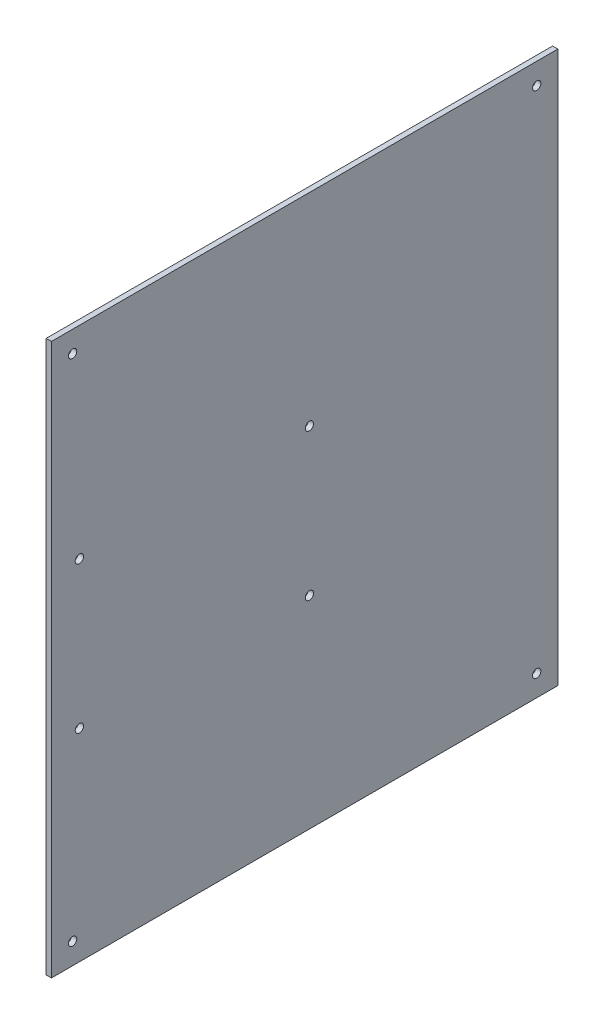
ISO-10303-21;
HEADER;
FILE_DESCRIPTION(('STEP AP214'),'2;1');
FILE_NAME('part.step','',(''),(''),'','','');
FILE_SCHEMA(('AUTOMOTIVE_DESIGN { 1 0 10303 214 1 1 1 1 }'));
ENDSEC;
DATA;
#1=APPLICATION_CONTEXT('core data for automotive mechanical design processes');
#2=APPLICATION_PROTOCOL_DEFINITION('international standard','automotive_design',2000,#1);
#3=PRODUCT_CONTEXT('',#1,'mechanical');
#4=PRODUCT('Part','Part','',(#3));
#5=PRODUCT_RELATED_PRODUCT_CATEGORY('part','',(#4));
#6=PRODUCT_DEFINITION_FORMATION('','',#4);
#7=PRODUCT_DEFINITION_CONTEXT('part definition',#1,'design');
#8=PRODUCT_DEFINITION('design','',#6,#7);
#9=PRODUCT_DEFINITION_SHAPE('','',#8);
#10=(LENGTH_UNIT() NAMED_UNIT(*) SI_UNIT(.MILLI.,.METRE.));
#11=(NAMED_UNIT(*) PLANE_ANGLE_UNIT() SI_UNIT($,.RADIAN.));
#12=(NAMED_UNIT(*) SI_UNIT($,.STERADIAN.) SOLID_ANGLE_UNIT());
#13=UNCERTAINTY_MEASURE_WITH_UNIT(LENGTH_MEASURE(1.E-05),#10,'distance_accuracy_value','');
#14=(GEOMETRIC_REPRESENTATION_CONTEXT(3) GLOBAL_UNCERTAINTY_ASSIGNED_CONTEXT((#13)) GLOBAL_UNIT_ASSIGNED_CONTEXT((#10,
#11,#12)) REPRESENTATION_CONTEXT('',''));
#15=CARTESIAN_POINT('',(0.,0.,0.));
#16=DIRECTION('',(0.,0.,1.));
#17=DIRECTION('',(1.,0.,0.));
#18=AXIS2_PLACEMENT_3D('',#15,#16,#17);
#19=CARTESIAN_POINT('',(1.58234,0.,-151.892));
#20=DIRECTION('',(0.,0.,1.));
#21=DIRECTION('',(1.,0.,0.));
#22=AXIS2_PLACEMENT_3D('',#19,#20,#21);
#23=PLANE('',#22);
#24=DIRECTION('',(0.,1.,0.));
#25=VECTOR('',#24,1.);
#26=CARTESIAN_POINT('',(0.,0.,-151.892));
#27=LINE('',#26,#25);
#28=CARTESIAN_POINT('',(0.,-82.677,-151.892));
#29=VERTEX_POINT('',#28);
#30=CARTESIAN_POINT('',(0.,82.677,-151.892));
#31=VERTEX_POINT('',#30);
#32=EDGE_CURVE('E126',#29,#31,#27,.T.);
#33=ORIENTED_EDGE('',*,*,#32,.T.);
#34=DIRECTION('',(-1.,0.,0.));
#35=VECTOR('',#34,1.);
#36=CARTESIAN_POINT('',(1.58234,82.677,-151.892));
#37=LINE('',#36,#35);
#38=CARTESIAN_POINT('',(1.58234,82.677,-151.892));
#39=VERTEX_POINT('',#38);
#40=EDGE_CURVE('E11',#39,#31,#37,.T.);
#41=ORIENTED_EDGE('',*,*,#40,.F.);
#42=DIRECTION('',(0.,1.,0.));
#43=VECTOR('',#42,1.);
#44=CARTESIAN_POINT('',(1.58234,0.,-151.892));
#45=LINE('',#44,#43);
#46=CARTESIAN_POINT('',(1.58234,-82.677,-151.892));
#47=VERTEX_POINT('',#46);
#48=EDGE_CURVE('E89',#47,#39,#45,.T.);
#49=ORIENTED_EDGE('',*,*,#48,.F.);
#50=DIRECTION('',(-1.,0.,0.));
#51=VECTOR('',#50,1.);
#52=CARTESIAN_POINT('',(1.58234,-82.677,-151.892));
#53=LINE('',#52,#51);
#54=EDGE_CURVE('E57',#47,#29,#53,.T.);
#55=ORIENTED_EDGE('',*,*,#54,.T.);
#56=EDGE_LOOP('',(#33,#41,#49,#55));
#57=FACE_BOUND('',#56,.T.);
#58=ADVANCED_FACE('F39',(#57),#23,.F.);
#59=CARTESIAN_POINT('',(1.58234,82.677,0.));
#60=DIRECTION('',(0.,-1.,0.));
#61=DIRECTION('',(0.,0.,-1.));
#62=AXIS2_PLACEMENT_3D('',#59,#60,#61);
#63=PLANE('',#62);
#64=DIRECTION('',(0.,0.,1.));
#65=VECTOR('',#64,1.);
#66=CARTESIAN_POINT('',(0.,82.677,0.));
#67=LINE('',#66,#65);
#68=CARTESIAN_POINT('',(0.,82.677,0.));
#69=VERTEX_POINT('',#68);
#70=EDGE_CURVE('E94',#31,#69,#67,.T.);
#71=ORIENTED_EDGE('',*,*,#70,.T.);
#72=DIRECTION('',(-1.,0.,0.));
#73=VECTOR('',#72,1.);
#74=CARTESIAN_POINT('',(1.58234,82.677,0.));
#75=LINE('',#74,#73);
#76=CARTESIAN_POINT('',(1.58234,82.677,0.));
#77=VERTEX_POINT('',#76);
#78=EDGE_CURVE('E48',#77,#69,#75,.T.);
#79=ORIENTED_EDGE('',*,*,#78,.F.);
#80=DIRECTION('',(0.,0.,1.));
#81=VECTOR('',#80,1.);
#82=CARTESIAN_POINT('',(1.58234,82.677,0.));
#83=LINE('',#82,#81);
#84=EDGE_CURVE('E83',#39,#77,#83,.T.);
#85=ORIENTED_EDGE('',*,*,#84,.F.);
#86=ORIENTED_EDGE('',*,*,#40,.T.);
#87=EDGE_LOOP('',(#71,#79,#85,#86));
#88=FACE_BOUND('',#87,.T.);
#89=ADVANCED_FACE('F92',(#88),#63,.F.);
#90=CARTESIAN_POINT('',(1.58234,0.,0.));
#91=DIRECTION('',(0.,0.,1.));
#92=DIRECTION('',(1.,0.,0.));
#93=AXIS2_PLACEMENT_3D('',#90,#91,#92);
#94=PLANE('',#93);
#95=DIRECTION('',(0.,1.,0.));
#96=VECTOR('',#95,1.);
#97=CARTESIAN_POINT('',(0.,0.,0.));
#98=LINE('',#97,#96);
#99=CARTESIAN_POINT('',(0.,-82.677,0.));
#100=VERTEX_POINT('',#99);
#101=EDGE_CURVE('E131',#100,#69,#98,.T.);
#102=ORIENTED_EDGE('',*,*,#101,.F.);
#103=DIRECTION('',(-1.,0.,0.));
#104=VECTOR('',#103,1.);
#105=CARTESIAN_POINT('',(1.58234,-82.677,0.));
#106=LINE('',#105,#104);
#107=CARTESIAN_POINT('',(1.58234,-82.677,0.));
#108=VERTEX_POINT('',#107);
#109=EDGE_CURVE('E68',#108,#100,#106,.T.);
#110=ORIENTED_EDGE('',*,*,#109,.F.);
#111=DIRECTION('',(0.,1.,0.));
#112=VECTOR('',#111,1.);
#113=CARTESIAN_POINT('',(1.58234,0.,0.));
#114=LINE('',#113,#112);
#115=EDGE_CURVE('E87',#108,#77,#114,.T.);
#116=ORIENTED_EDGE('',*,*,#115,.T.);
#117=ORIENTED_EDGE('',*,*,#78,.T.);
#118=EDGE_LOOP('',(#102,#110,#116,#117));
#119=FACE_BOUND('',#118,.T.);
#120=ADVANCED_FACE('F97',(#119),#94,.T.);
#121=CARTESIAN_POINT('',(1.58234,22.,-8.382));
#122=DIRECTION('',(-1.,0.,0.));
#123=DIRECTION('',(0.,0.,1.));
#124=AXIS2_PLACEMENT_3D('',#121,#122,#123);
#125=CYLINDRICAL_SURFACE('',#124,1.25);
#126=CARTESIAN_POINT('',(1.58234,22.,-8.382));
#127=DIRECTION('',(1.,0.,0.));
#128=DIRECTION('',(0.,0.,-1.));
#129=AXIS2_PLACEMENT_3D('',#126,#127,#128);
#130=CIRCLE('',#129,1.25);
#131=CARTESIAN_POINT('',(1.58234,22.,-9.632));
#132=VERTEX_POINT('',#131);
#133=EDGE_CURVE('E110',#132,#132,#130,.T.);
#134=ORIENTED_EDGE('',*,*,#133,.T.);
#135=EDGE_LOOP('',(#134));
#136=FACE_BOUND('',#135,.T.);
#137=CARTESIAN_POINT('',(0.,22.,-8.382));
#138=DIRECTION('',(1.,0.,0.));
#139=DIRECTION('',(0.,0.,-1.));
#140=AXIS2_PLACEMENT_3D('',#137,#138,#139);
#141=CIRCLE('',#140,1.25);
#142=CARTESIAN_POINT('',(0.,22.,-9.632));
#143=VERTEX_POINT('',#142);
#144=EDGE_CURVE('E145',#143,#143,#141,.T.);
#145=ORIENTED_EDGE('',*,*,#144,.F.);
#146=EDGE_LOOP('',(#145));
#147=FACE_BOUND('',#146,.T.);
#148=ADVANCED_FACE('F187',(#136,#147),#125,.F.);
#149=CARTESIAN_POINT('',(1.58234,76.327,-6.35));
#150=DIRECTION('',(-1.,0.,0.));
#151=DIRECTION('',(0.,0.,1.));
#152=AXIS2_PLACEMENT_3D('',#149,#150,#151);
#153=CYLINDRICAL_SURFACE('',#152,1.25);
#154=CARTESIAN_POINT('',(1.58234,76.327,-6.35));
#155=DIRECTION('',(1.,0.,0.));
#156=DIRECTION('',(0.,0.,-1.));
#157=AXIS2_PLACEMENT_3D('',#154,#155,#156);
#158=CIRCLE('',#157,1.25);
#159=CARTESIAN_POINT('',(1.58234,76.327,-7.6));
#160=VERTEX_POINT('',#159);
#161=EDGE_CURVE('E107',#160,#160,#158,.T.);
#162=ORIENTED_EDGE('',*,*,#161,.T.);
#163=EDGE_LOOP('',(#162));
#164=FACE_BOUND('',#163,.T.);
#165=CARTESIAN_POINT('',(0.,76.327,-6.35));
#166=DIRECTION('',(1.,0.,0.));
#167=DIRECTION('',(0.,0.,-1.));
#168=AXIS2_PLACEMENT_3D('',#165,#166,#167);
#169=CIRCLE('',#168,1.25);
#170=CARTESIAN_POINT('',(0.,76.327,-7.6));
#171=VERTEX_POINT('',#170);
#172=EDGE_CURVE('E137',#171,#171,#169,.T.);
#173=ORIENTED_EDGE('',*,*,#172,.F.);
#174=EDGE_LOOP('',(#173));
#175=FACE_BOUND('',#174,.T.);
#176=ADVANCED_FACE('F189',(#164,#175),#153,.F.);
#177=CARTESIAN_POINT('',(1.58234,76.327,-145.542));
#178=DIRECTION('',(-1.,0.,0.));
#179=DIRECTION('',(0.,0.,1.));
#180=AXIS2_PLACEMENT_3D('',#177,#178,#179);
#181=CYLINDRICAL_SURFACE('',#180,1.25);
#182=CARTESIAN_POINT('',(1.58234,76.327,-145.542));
#183=DIRECTION('',(1.,0.,0.));
#184=DIRECTION('',(0.,0.,-1.));
#185=AXIS2_PLACEMENT_3D('',#182,#183,#184);
#186=CIRCLE('',#185,1.25);
#187=CARTESIAN_POINT('',(1.58234,76.327,-146.792));
#188=VERTEX_POINT('',#187);
#189=EDGE_CURVE('E102',#188,#188,#186,.T.);
#190=ORIENTED_EDGE('',*,*,#189,.T.);
#191=EDGE_LOOP('',(#190));
#192=FACE_BOUND('',#191,.T.);
#193=CARTESIAN_POINT('',(0.,76.327,-145.542));
#194=DIRECTION('',(1.,0.,0.));
#195=DIRECTION('',(0.,0.,-1.));
#196=AXIS2_PLACEMENT_3D('',#193,#194,#195);
#197=CIRCLE('',#196,1.25);
#198=CARTESIAN_POINT('',(0.,76.327,-146.792));
#199=VERTEX_POINT('',#198);
#200=EDGE_CURVE('E136',#199,#199,#197,.T.);
#201=ORIENTED_EDGE('',*,*,#200,.F.);
#202=EDGE_LOOP('',(#201));
#203=FACE_BOUND('',#202,.T.);
#204=ADVANCED_FACE('F197',(#192,#203),#181,.F.);
#205=CARTESIAN_POINT('',(1.58234,-82.677,0.));
#206=DIRECTION('',(0.,-1.,0.));
#207=DIRECTION('',(0.,0.,-1.));
#208=AXIS2_PLACEMENT_3D('',#205,#206,#207);
#209=PLANE('',#208);
#210=DIRECTION('',(0.,0.,1.));
#211=VECTOR('',#210,1.);
#212=CARTESIAN_POINT('',(0.,-82.677,0.));
#213=LINE('',#212,#211);
#214=EDGE_CURVE('E133',#29,#100,#213,.T.);
#215=ORIENTED_EDGE('',*,*,#214,.F.);
#216=ORIENTED_EDGE('',*,*,#54,.F.);
#217=DIRECTION('',(0.,0.,1.));
#218=VECTOR('',#217,1.);
#219=CARTESIAN_POINT('',(1.58234,-82.677,0.));
#220=LINE('',#219,#218);
#221=EDGE_CURVE('E98',#47,#108,#220,.T.);
#222=ORIENTED_EDGE('',*,*,#221,.T.);
#223=ORIENTED_EDGE('',*,*,#109,.T.);
#224=EDGE_LOOP('',(#215,#216,#222,#223));
#225=FACE_BOUND('',#224,.T.);
#226=ADVANCED_FACE('F175',(#225),#209,.T.);
#227=CARTESIAN_POINT('',(1.58234,-76.327,-6.35));
#228=DIRECTION('',(-1.,0.,0.));
#229=DIRECTION('',(0.,0.,1.));
#230=AXIS2_PLACEMENT_3D('',#227,#228,#229);
#231=CYLINDRICAL_SURFACE('',#230,1.25);
#232=CARTESIAN_POINT('',(1.58234,-76.327,-6.35));
#233=DIRECTION('',(1.,0.,0.));
#234=DIRECTION('',(0.,0.,-1.));
#235=AXIS2_PLACEMENT_3D('',#232,#233,#234);
#236=CIRCLE('',#235,1.25);
#237=CARTESIAN_POINT('',(1.58234,-76.327,-7.6));
#238=VERTEX_POINT('',#237);
#239=EDGE_CURVE('E164',#238,#238,#236,.F.);
#240=ORIENTED_EDGE('',*,*,#239,.F.);
#241=EDGE_LOOP('',(#240));
#242=FACE_BOUND('',#241,.T.);
#243=CARTESIAN_POINT('',(0.,-76.327,-6.35));
#244=DIRECTION('',(1.,0.,0.));
#245=DIRECTION('',(0.,0.,-1.));
#246=AXIS2_PLACEMENT_3D('',#243,#244,#245);
#247=CIRCLE('',#246,1.25);
#248=CARTESIAN_POINT('',(0.,-76.327,-7.6));
#249=VERTEX_POINT('',#248);
#250=EDGE_CURVE('E124',#249,#249,#247,.F.);
#251=ORIENTED_EDGE('',*,*,#250,.T.);
#252=EDGE_LOOP('',(#251));
#253=FACE_BOUND('',#252,.T.);
#254=ADVANCED_FACE('F166',(#242,#253),#231,.F.);
#255=CARTESIAN_POINT('',(1.58234,-22.,-77.382));
#256=DIRECTION('',(-1.,0.,0.));
#257=DIRECTION('',(0.,0.,1.));
#258=AXIS2_PLACEMENT_3D('',#255,#256,#257);
#259=CYLINDRICAL_SURFACE('',#258,1.25);
#260=CARTESIAN_POINT('',(1.58234,-22.,-77.382));
#261=DIRECTION('',(1.,0.,0.));
#262=DIRECTION('',(0.,0.,-1.));
#263=AXIS2_PLACEMENT_3D('',#260,#261,#262);
#264=CIRCLE('',#263,1.25);
#265=CARTESIAN_POINT('',(1.58234,-22.,-78.632));
#266=VERTEX_POINT('',#265);
#267=EDGE_CURVE('E156',#266,#266,#264,.F.);
#268=ORIENTED_EDGE('',*,*,#267,.F.);
#269=EDGE_LOOP('',(#268));
#270=FACE_BOUND('',#269,.T.);
#271=CARTESIAN_POINT('',(0.,-22.,-77.382));
#272=DIRECTION('',(1.,0.,0.));
#273=DIRECTION('',(0.,0.,-1.));
#274=AXIS2_PLACEMENT_3D('',#271,#272,#273);
#275=CIRCLE('',#274,1.25);
#276=CARTESIAN_POINT('',(0.,-22.,-78.632));
#277=VERTEX_POINT('',#276);
#278=EDGE_CURVE('E122',#277,#277,#275,.F.);
#279=ORIENTED_EDGE('',*,*,#278,.T.);
#280=EDGE_LOOP('',(#279));
#281=FACE_BOUND('',#280,.T.);
#282=ADVANCED_FACE('F173',(#270,#281),#259,.F.);
#283=CARTESIAN_POINT('',(1.58234,-76.327,-145.542));
#284=DIRECTION('',(-1.,0.,0.));
#285=DIRECTION('',(0.,0.,1.));
#286=AXIS2_PLACEMENT_3D('',#283,#284,#285);
#287=CYLINDRICAL_SURFACE('',#286,1.25);
#288=CARTESIAN_POINT('',(1.58234,-76.327,-145.542));
#289=DIRECTION('',(1.,0.,0.));
#290=DIRECTION('',(0.,0.,-1.));
#291=AXIS2_PLACEMENT_3D('',#288,#289,#290);
#292=CIRCLE('',#291,1.25);
#293=CARTESIAN_POINT('',(1.58234,-76.327,-146.792));
#294=VERTEX_POINT('',#293);
#295=EDGE_CURVE('E154',#294,#294,#292,.F.);
#296=ORIENTED_EDGE('',*,*,#295,.F.);
#297=EDGE_LOOP('',(#296));
#298=FACE_BOUND('',#297,.T.);
#299=CARTESIAN_POINT('',(0.,-76.327,-145.542));
#300=DIRECTION('',(1.,0.,0.));
#301=DIRECTION('',(0.,0.,-1.));
#302=AXIS2_PLACEMENT_3D('',#299,#300,#301);
#303=CIRCLE('',#302,1.25);
#304=CARTESIAN_POINT('',(0.,-76.327,-146.792));
#305=VERTEX_POINT('',#304);
#306=EDGE_CURVE('E118',#305,#305,#303,.F.);
#307=ORIENTED_EDGE('',*,*,#306,.T.);
#308=EDGE_LOOP('',(#307));
#309=FACE_BOUND('',#308,.T.);
#310=ADVANCED_FACE('F210',(#298,#309),#287,.F.);
#311=CARTESIAN_POINT('',(1.58234,-22.,-8.382));
#312=DIRECTION('',(-1.,0.,0.));
#313=DIRECTION('',(0.,0.,1.));
#314=AXIS2_PLACEMENT_3D('',#311,#312,#313);
#315=CYLINDRICAL_SURFACE('',#314,1.25);
#316=CARTESIAN_POINT('',(1.58234,-22.,-8.382));
#317=DIRECTION('',(1.,0.,0.));
#318=DIRECTION('',(0.,0.,-1.));
#319=AXIS2_PLACEMENT_3D('',#316,#317,#318);
#320=CIRCLE('',#319,1.25);
#321=CARTESIAN_POINT('',(1.58234,-22.,-9.632));
#322=VERTEX_POINT('',#321);
#323=EDGE_CURVE('E149',#322,#322,#320,.F.);
#324=ORIENTED_EDGE('',*,*,#323,.F.);
#325=EDGE_LOOP('',(#324));
#326=FACE_BOUND('',#325,.T.);
#327=CARTESIAN_POINT('',(0.,-22.,-8.382));
#328=DIRECTION('',(1.,0.,0.));
#329=DIRECTION('',(0.,0.,-1.));
#330=AXIS2_PLACEMENT_3D('',#327,#328,#329);
#331=CIRCLE('',#330,1.25);
#332=CARTESIAN_POINT('',(0.,-22.,-9.632));
#333=VERTEX_POINT('',#332);
#334=EDGE_CURVE('E116',#333,#333,#331,.F.);
#335=ORIENTED_EDGE('',*,*,#334,.T.);
#336=EDGE_LOOP('',(#335));
#337=FACE_BOUND('',#336,.T.);
#338=ADVANCED_FACE('F41',(#326,#337),#315,.F.);
#339=CARTESIAN_POINT('',(1.58234,22.,-77.382));
#340=DIRECTION('',(-1.,0.,0.));
#341=DIRECTION('',(0.,0.,1.));
#342=AXIS2_PLACEMENT_3D('',#339,#340,#341);
#343=CYLINDRICAL_SURFACE('',#342,1.25);
#344=CARTESIAN_POINT('',(1.58234,22.,-77.382));
#345=DIRECTION('',(1.,0.,0.));
#346=DIRECTION('',(0.,0.,-1.));
#347=AXIS2_PLACEMENT_3D('',#344,#345,#346);
#348=CIRCLE('',#347,1.25);
#349=CARTESIAN_POINT('',(1.58234,22.,-78.632));
#350=VERTEX_POINT('',#349);
#351=EDGE_CURVE('E111',#350,#350,#348,.T.);
#352=ORIENTED_EDGE('',*,*,#351,.T.);
#353=EDGE_LOOP('',(#352));
#354=FACE_BOUND('',#353,.T.);
#355=CARTESIAN_POINT('',(0.,22.,-77.382));
#356=DIRECTION('',(1.,0.,0.));
#357=DIRECTION('',(0.,0.,-1.));
#358=AXIS2_PLACEMENT_3D('',#355,#356,#357);
#359=CIRCLE('',#358,1.25);
#360=CARTESIAN_POINT('',(0.,22.,-78.632));
#361=VERTEX_POINT('',#360);
#362=EDGE_CURVE('E144',#361,#361,#359,.T.);
#363=ORIENTED_EDGE('',*,*,#362,.F.);
#364=EDGE_LOOP('',(#363));
#365=FACE_BOUND('',#364,.T.);
#366=ADVANCED_FACE('F220',(#354,#365),#343,.F.);
#367=CARTESIAN_POINT('',(1.58234,0.,0.));
#368=DIRECTION('',(1.,0.,0.));
#369=DIRECTION('',(0.,0.,-1.));
#370=AXIS2_PLACEMENT_3D('',#367,#368,#369);
#371=PLANE('',#370);
#372=ORIENTED_EDGE('',*,*,#323,.T.);
#373=EDGE_LOOP('',(#372));
#374=FACE_BOUND('',#373,.T.);
#375=ORIENTED_EDGE('',*,*,#295,.T.);
#376=EDGE_LOOP('',(#375));
#377=FACE_BOUND('',#376,.T.);
#378=ORIENTED_EDGE('',*,*,#267,.T.);
#379=EDGE_LOOP('',(#378));
#380=FACE_BOUND('',#379,.T.);
#381=ORIENTED_EDGE('',*,*,#239,.T.);
#382=EDGE_LOOP('',(#381));
#383=FACE_BOUND('',#382,.T.);
#384=ORIENTED_EDGE('',*,*,#48,.T.);
#385=ORIENTED_EDGE('',*,*,#84,.T.);
#386=ORIENTED_EDGE('',*,*,#115,.F.);
#387=ORIENTED_EDGE('',*,*,#221,.F.);
#388=EDGE_LOOP('',(#384,#385,#386,#387));
#389=FACE_BOUND('',#388,.T.);
#390=ORIENTED_EDGE('',*,*,#189,.F.);
#391=EDGE_LOOP('',(#390));
#392=FACE_BOUND('',#391,.T.);
#393=ORIENTED_EDGE('',*,*,#161,.F.);
#394=EDGE_LOOP('',(#393));
#395=FACE_BOUND('',#394,.T.);
#396=ORIENTED_EDGE('',*,*,#133,.F.);
#397=EDGE_LOOP('',(#396));
#398=FACE_BOUND('',#397,.T.);
#399=ORIENTED_EDGE('',*,*,#351,.F.);
#400=EDGE_LOOP('',(#399));
#401=FACE_BOUND('',#400,.T.);
#402=ADVANCED_FACE('F82',(#374,#377,#380,#383,#389,#392,#395,#398,#401),#371,.T.);
#403=CARTESIAN_POINT('',(0.,0.,0.));
#404=DIRECTION('',(1.,0.,0.));
#405=DIRECTION('',(0.,0.,-1.));
#406=AXIS2_PLACEMENT_3D('',#403,#404,#405);
#407=PLANE('',#406);
#408=ORIENTED_EDGE('',*,*,#334,.F.);
#409=EDGE_LOOP('',(#408));
#410=FACE_BOUND('',#409,.T.);
#411=ORIENTED_EDGE('',*,*,#306,.F.);
#412=EDGE_LOOP('',(#411));
#413=FACE_BOUND('',#412,.T.);
#414=ORIENTED_EDGE('',*,*,#278,.F.);
#415=EDGE_LOOP('',(#414));
#416=FACE_BOUND('',#415,.T.);
#417=ORIENTED_EDGE('',*,*,#250,.F.);
#418=EDGE_LOOP('',(#417));
#419=FACE_BOUND('',#418,.T.);
#420=ORIENTED_EDGE('',*,*,#32,.F.);
#421=ORIENTED_EDGE('',*,*,#214,.T.);
#422=ORIENTED_EDGE('',*,*,#101,.T.);
#423=ORIENTED_EDGE('',*,*,#70,.F.);
#424=EDGE_LOOP('',(#420,#421,#422,#423));
#425=FACE_BOUND('',#424,.T.);
#426=ORIENTED_EDGE('',*,*,#200,.T.);
#427=EDGE_LOOP('',(#426));
#428=FACE_BOUND('',#427,.T.);
#429=ORIENTED_EDGE('',*,*,#172,.T.);
#430=EDGE_LOOP('',(#429));
#431=FACE_BOUND('',#430,.T.);
#432=ORIENTED_EDGE('',*,*,#144,.T.);
#433=EDGE_LOOP('',(#432));
#434=FACE_BOUND('',#433,.T.);
#435=ORIENTED_EDGE('',*,*,#362,.T.);
#436=EDGE_LOOP('',(#435));
#437=FACE_BOUND('',#436,.T.);
#438=ADVANCED_FACE('F176',(#410,#413,#416,#419,#425,#428,#431,#434,#437),#407,.F.);
#439=CLOSED_SHELL('',(#58,#89,#120,#148,#176,#204,#226,#254,#282,#310,#338,#366,#402,#438));
#440=MANIFOLD_SOLID_BREP('B2',#439);
#441=ADVANCED_BREP_SHAPE_REPRESENTATION('',(#18,#440),#14);
#442=SHAPE_DEFINITION_REPRESENTATION(#9,#441);
ENDSEC;
END-ISO-10303-21;
